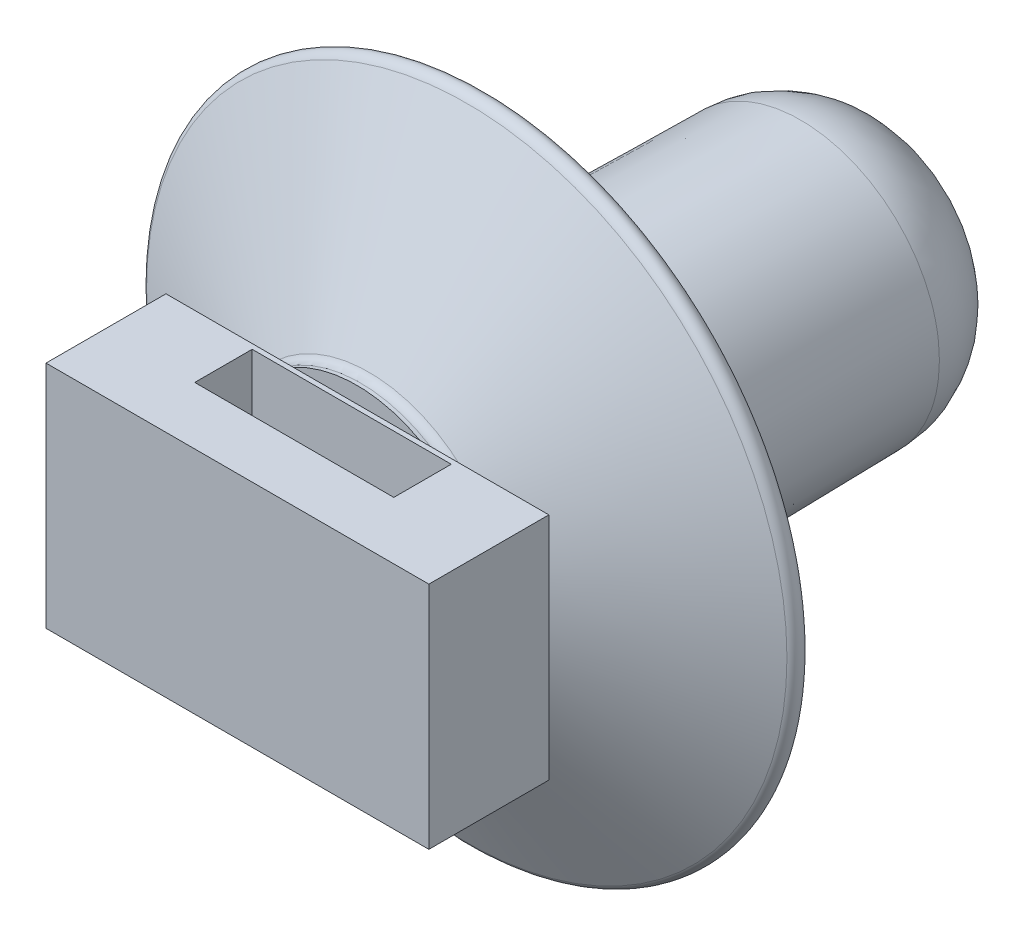
ISO-10303-21;
HEADER;
FILE_DESCRIPTION(('STEP AP214'),'2;1');
FILE_NAME('part.step','',(''),(''),'','','');
FILE_SCHEMA(('AUTOMOTIVE_DESIGN { 1 0 10303 214 1 1 1 1 }'));
ENDSEC;
DATA;
#1=APPLICATION_CONTEXT('core data for automotive mechanical design processes');
#2=APPLICATION_PROTOCOL_DEFINITION('international standard','automotive_design',2000,#1);
#3=PRODUCT_CONTEXT('',#1,'mechanical');
#4=PRODUCT('Part','Part','',(#3));
#5=PRODUCT_RELATED_PRODUCT_CATEGORY('part','',(#4));
#6=PRODUCT_DEFINITION_FORMATION('','',#4);
#7=PRODUCT_DEFINITION_CONTEXT('part definition',#1,'design');
#8=PRODUCT_DEFINITION('design','',#6,#7);
#9=PRODUCT_DEFINITION_SHAPE('','',#8);
#10=(LENGTH_UNIT() NAMED_UNIT(*) SI_UNIT(.MILLI.,.METRE.));
#11=(NAMED_UNIT(*) PLANE_ANGLE_UNIT() SI_UNIT($,.RADIAN.));
#12=(NAMED_UNIT(*) SI_UNIT($,.STERADIAN.) SOLID_ANGLE_UNIT());
#13=UNCERTAINTY_MEASURE_WITH_UNIT(LENGTH_MEASURE(1.E-05),#10,'distance_accuracy_value','');
#14=(GEOMETRIC_REPRESENTATION_CONTEXT(3) GLOBAL_UNCERTAINTY_ASSIGNED_CONTEXT((#13)) GLOBAL_UNIT_ASSIGNED_CONTEXT((#10,
#11,#12)) REPRESENTATION_CONTEXT('',''));
#15=CARTESIAN_POINT('',(0.,0.,0.));
#16=DIRECTION('',(0.,0.,1.));
#17=DIRECTION('',(1.,0.,0.));
#18=AXIS2_PLACEMENT_3D('',#15,#16,#17);
#19=CARTESIAN_POINT('',(0.019624843137266,0.,4.146));
#20=DIRECTION('',(0.,0.,1.));
#21=DIRECTION('',(1.,0.,0.));
#22=AXIS2_PLACEMENT_3D('',#19,#20,#21);
#23=PLANE('',#22);
#24=DIRECTION('',(-1.,0.,0.));
#25=VECTOR('',#24,1.);
#26=CARTESIAN_POINT('',(0.019624843137266,-2.99999999999994,4.146));
#27=LINE('',#26,#25);
#28=CARTESIAN_POINT('',(5.01962484313727,-2.99999999999994,4.146));
#29=VERTEX_POINT('',#28);
#30=CARTESIAN_POINT('',(-4.98037515686273,-2.99999999999994,4.146));
#31=VERTEX_POINT('',#30);
#32=EDGE_CURVE('E209',#29,#31,#27,.T.);
#33=ORIENTED_EDGE('',*,*,#32,.F.);
#34=DIRECTION('',(0.,-1.,0.));
#35=VECTOR('',#34,1.);
#36=CARTESIAN_POINT('',(5.01962484313727,0.,4.146));
#37=LINE('',#36,#35);
#38=CARTESIAN_POINT('',(5.01962484313727,3.00000000000007,4.146));
#39=VERTEX_POINT('',#38);
#40=EDGE_CURVE('E41',#39,#29,#37,.T.);
#41=ORIENTED_EDGE('',*,*,#40,.F.);
#42=DIRECTION('',(1.,0.,0.));
#43=VECTOR('',#42,1.);
#44=CARTESIAN_POINT('',(0.019624843137266,3.00000000000007,4.146));
#45=LINE('',#44,#43);
#46=CARTESIAN_POINT('',(-4.98037515686273,3.00000000000007,4.146));
#47=VERTEX_POINT('',#46);
#48=EDGE_CURVE('E221',#47,#39,#45,.T.);
#49=ORIENTED_EDGE('',*,*,#48,.F.);
#50=DIRECTION('',(0.,1.,0.));
#51=VECTOR('',#50,1.);
#52=CARTESIAN_POINT('',(-4.98037515686273,0.,4.146));
#53=LINE('',#52,#51);
#54=EDGE_CURVE('E244',#31,#47,#53,.T.);
#55=ORIENTED_EDGE('',*,*,#54,.F.);
#56=EDGE_LOOP('',(#33,#41,#49,#55));
#57=FACE_BOUND('',#56,.T.);
#58=ADVANCED_FACE('F16',(#57),#23,.T.);
#59=CARTESIAN_POINT('',(-1.08671064398304,0.,-13.0777778328722));
#60=CARTESIAN_POINT('',(-1.08671064398304,2.17345528796615,-13.0777778328722));
#61=CARTESIAN_POINT('',(1.08674464398311,2.17345528796615,-13.0777778328722));
#62=CARTESIAN_POINT('',(1.08674464398311,0.,-13.0777778328722));
#63=CARTESIAN_POINT('',(1.08674464398311,-2.17345528796615,-13.0777778328722));
#64=CARTESIAN_POINT('',(-1.08671064398304,-2.17345528796615,-13.0777778328722));
#65=CARTESIAN_POINT('',(-1.08671064398304,0.,-13.0777778328722));
#66=CARTESIAN_POINT('',(-2.55409895821178,0.,-13.0777778328722));
#67=CARTESIAN_POINT('',(-2.55409895821178,5.10823191642361,-13.0777778328722));
#68=CARTESIAN_POINT('',(2.55413295821183,5.10823191642361,-13.0777778328722));
#69=CARTESIAN_POINT('',(2.55413295821182,0.,-13.0777778328722));
#70=CARTESIAN_POINT('',(2.55413295821183,-5.10823191642361,-13.0777778328722));
#71=CARTESIAN_POINT('',(-2.55409895821178,-5.10823191642361,-13.0777778328722));
#72=CARTESIAN_POINT('',(-2.55409895821178,0.,-13.0777778328722));
#73=CARTESIAN_POINT('',(-3.60071433241901,0.,-12.0492717691039));
#74=CARTESIAN_POINT('',(-3.60071433241901,7.20146266483808,-12.0492717691039));
#75=CARTESIAN_POINT('',(3.60074833241908,7.20146266483808,-12.0492717691039));
#76=CARTESIAN_POINT('',(3.60074833241908,0.,-12.0492717691039));
#77=CARTESIAN_POINT('',(3.60074833241908,-7.20146266483808,-12.0492717691039));
#78=CARTESIAN_POINT('',(-3.60071433241901,-7.20146266483808,-12.0492717691039));
#79=CARTESIAN_POINT('',(-3.60071433241901,0.,-12.0492717691039));
#80=CARTESIAN_POINT('',(-3.62632378968028,0.,-10.5821069452229));
#81=CARTESIAN_POINT('',(-3.62632378968028,7.25268157936061,-10.5821069452229));
#82=CARTESIAN_POINT('',(3.62635778968033,7.25268157936061,-10.5821069452229));
#83=CARTESIAN_POINT('',(3.62635778968033,0.,-10.5821069452229));
#84=CARTESIAN_POINT('',(3.62635778968033,-7.25268157936061,-10.5821069452229));
#85=CARTESIAN_POINT('',(-3.62632378968028,-7.25268157936061,-10.5821069452229));
#86=CARTESIAN_POINT('',(-3.62632378968028,0.,-10.5821069452229));
#87=(BOUNDED_SURFACE() B_SPLINE_SURFACE(3,3,((#59,#60,#61,#62,#63,#64,#65),(#66,#67,#68,#69,#70,
#71,#72),(#73,#74,#75,#76,#77,#78,#79),(#80,#81,#82,#83,#84,#85,#86)),.UNSPECIFIED.,.F.,.T.,
.F.) B_SPLINE_SURFACE_WITH_KNOTS((4,4),(4,3,4),(0.,1.),(0.,0.5,1.),
.UNSPECIFIED.) GEOMETRIC_REPRESENTATION_ITEM() RATIONAL_B_SPLINE_SURFACE(((1.,0.333333333333333,
0.333333333333333,1.,0.333333333333333,0.333333333333333,1.),(0.808833632769457,
0.269611210923152,0.269611210923152,0.808833632769457,0.269611210923152,0.269611210923152,
0.808833632769457),(0.808833632769457,0.269611210923152,0.269611210923152,0.808833632769457,
0.269611210923152,0.269611210923152,0.808833632769457),(1.,0.333333333333333,0.333333333333333,
1.,0.333333333333333,0.333333333333333,1.))) REPRESENTATION_ITEM('') SURFACE());
#88=CARTESIAN_POINT('',(1.70000000335527E-05,0.,-13.0777778328722));
#89=DIRECTION('',(0.,0.,-1.));
#90=DIRECTION('',(-1.,0.,0.));
#91=AXIS2_PLACEMENT_3D('',#88,#89,#90);
#92=CIRCLE('',#91,1.08672764398307);
#93=CARTESIAN_POINT('',(-1.08671064398304,0.,-13.0777778328722));
#94=VERTEX_POINT('',#93);
#95=EDGE_CURVE('E165',#94,#94,#92,.T.);
#96=CARTESIAN_POINT('',(1.70000000335527E-05,0.,-10.5821069452229));
#97=DIRECTION('',(0.,0.,1.));
#98=DIRECTION('',(-1.,0.,0.));
#99=AXIS2_PLACEMENT_3D('',#96,#97,#98);
#100=CIRCLE('',#99,3.62634078968032);
#101=CARTESIAN_POINT('',(-3.62632378968028,0.,-10.5821069452229));
#102=VERTEX_POINT('',#101);
#103=EDGE_CURVE('E167',#102,#102,#100,.T.);
#104=ORIENTED_EDGE('',*,*,#95,.F.);
#105=EDGE_LOOP('',(#104));
#106=FACE_BOUND('',#105,.T.);
#107=ORIENTED_EDGE('',*,*,#103,.F.);
#108=EDGE_LOOP('',(#107));
#109=FACE_BOUND('',#108,.T.);
#110=ADVANCED_FACE('F294',(#106,#109),#87,.T.);
#111=CARTESIAN_POINT('',(2.600017,-6.175,2.642));
#112=DIRECTION('',(0.,0.,1.));
#113=DIRECTION('',(1.,0.,0.));
#114=AXIS2_PLACEMENT_3D('',#111,#112,#113);
#115=PLANE('',#114);
#116=DIRECTION('',(-1.,0.,0.));
#117=VECTOR('',#116,1.);
#118=CARTESIAN_POINT('',(0.019624843137266,-2.99999999999994,2.642));
#119=LINE('',#118,#117);
#120=CARTESIAN_POINT('',(2.600017,-2.99999999999994,2.642));
#121=VERTEX_POINT('',#120);
#122=CARTESIAN_POINT('',(-2.599983,-2.99999999999994,2.642));
#123=VERTEX_POINT('',#122);
#124=EDGE_CURVE('E140',#121,#123,#119,.T.);
#125=ORIENTED_EDGE('',*,*,#124,.T.);
#126=DIRECTION('',(0.,1.,0.));
#127=VECTOR('',#126,1.);
#128=CARTESIAN_POINT('',(-2.599983,3.35000000000006,2.642));
#129=LINE('',#128,#127);
#130=CARTESIAN_POINT('',(-2.599983,3.00000000000007,2.642));
#131=VERTEX_POINT('',#130);
#132=EDGE_CURVE('E125',#123,#131,#129,.T.);
#133=ORIENTED_EDGE('',*,*,#132,.T.);
#134=DIRECTION('',(1.,0.,0.));
#135=VECTOR('',#134,1.);
#136=CARTESIAN_POINT('',(0.019624843137266,3.00000000000007,2.642));
#137=LINE('',#136,#135);
#138=CARTESIAN_POINT('',(2.600017,3.00000000000007,2.642));
#139=VERTEX_POINT('',#138);
#140=EDGE_CURVE('E202',#131,#139,#137,.T.);
#141=ORIENTED_EDGE('',*,*,#140,.T.);
#142=DIRECTION('',(0.,1.,0.));
#143=VECTOR('',#142,1.);
#144=CARTESIAN_POINT('',(2.600017,3.35000000000006,2.642));
#145=LINE('',#144,#143);
#146=EDGE_CURVE('E10',#121,#139,#145,.T.);
#147=ORIENTED_EDGE('',*,*,#146,.F.);
#148=EDGE_LOOP('',(#125,#133,#141,#147));
#149=FACE_BOUND('',#148,.T.);
#150=ADVANCED_FACE('F141',(#149),#115,.F.);
#151=CARTESIAN_POINT('',(2.600017,-6.175,1.142));
#152=DIRECTION('',(1.,0.,0.));
#153=DIRECTION('',(0.,1.,0.));
#154=AXIS2_PLACEMENT_3D('',#151,#152,#153);
#155=PLANE('',#154);
#156=DIRECTION('',(0.,0.,1.));
#157=VECTOR('',#156,1.);
#158=CARTESIAN_POINT('',(2.600017,-2.99999999999994,1.012));
#159=LINE('',#158,#157);
#160=CARTESIAN_POINT('',(2.600017,-2.99999999999994,1.142));
#161=VERTEX_POINT('',#160);
#162=EDGE_CURVE('E146',#161,#121,#159,.T.);
#163=ORIENTED_EDGE('',*,*,#162,.T.);
#164=ORIENTED_EDGE('',*,*,#146,.T.);
#165=DIRECTION('',(0.,0.,-1.));
#166=VECTOR('',#165,1.);
#167=CARTESIAN_POINT('',(2.600017,3.00000000000007,1.012));
#168=LINE('',#167,#166);
#169=CARTESIAN_POINT('',(2.600017,3.00000000000007,1.142));
#170=VERTEX_POINT('',#169);
#171=EDGE_CURVE('E200',#139,#170,#168,.T.);
#172=ORIENTED_EDGE('',*,*,#171,.T.);
#173=DIRECTION('',(0.,1.,0.));
#174=VECTOR('',#173,1.);
#175=CARTESIAN_POINT('',(2.600017,3.35000000000006,1.142));
#176=LINE('',#175,#174);
#177=EDGE_CURVE('E27',#161,#170,#176,.T.);
#178=ORIENTED_EDGE('',*,*,#177,.F.);
#179=EDGE_LOOP('',(#163,#164,#172,#178));
#180=FACE_BOUND('',#179,.T.);
#181=ADVANCED_FACE('F322',(#180),#155,.F.);
#182=CARTESIAN_POINT('',(-2.599983,-6.175,1.142));
#183=DIRECTION('',(0.,0.,-1.));
#184=DIRECTION('',(0.,-1.,0.));
#185=AXIS2_PLACEMENT_3D('',#182,#183,#184);
#186=PLANE('',#185);
#187=DIRECTION('',(1.,0.,0.));
#188=VECTOR('',#187,1.);
#189=CARTESIAN_POINT('',(0.019624843137266,-2.99999999999994,1.142));
#190=LINE('',#189,#188);
#191=CARTESIAN_POINT('',(-2.599983,-2.99999999999994,1.142));
#192=VERTEX_POINT('',#191);
#193=EDGE_CURVE('E151',#192,#161,#190,.T.);
#194=ORIENTED_EDGE('',*,*,#193,.T.);
#195=ORIENTED_EDGE('',*,*,#177,.T.);
#196=DIRECTION('',(-1.,0.,0.));
#197=VECTOR('',#196,1.);
#198=CARTESIAN_POINT('',(0.019624843137266,3.00000000000007,1.142));
#199=LINE('',#198,#197);
#200=CARTESIAN_POINT('',(-2.599983,3.00000000000007,1.142));
#201=VERTEX_POINT('',#200);
#202=EDGE_CURVE('E203',#170,#201,#199,.T.);
#203=ORIENTED_EDGE('',*,*,#202,.T.);
#204=DIRECTION('',(0.,1.,0.));
#205=VECTOR('',#204,1.);
#206=CARTESIAN_POINT('',(-2.599983,3.35000000000006,1.142));
#207=LINE('',#206,#205);
#208=EDGE_CURVE('E137',#192,#201,#207,.T.);
#209=ORIENTED_EDGE('',*,*,#208,.F.);
#210=EDGE_LOOP('',(#194,#195,#203,#209));
#211=FACE_BOUND('',#210,.T.);
#212=ADVANCED_FACE('F317',(#211),#186,.F.);
#213=CARTESIAN_POINT('',(-2.599983,-6.175,2.642));
#214=DIRECTION('',(-1.,0.,0.));
#215=DIRECTION('',(0.,0.,1.));
#216=AXIS2_PLACEMENT_3D('',#213,#214,#215);
#217=PLANE('',#216);
#218=DIRECTION('',(0.,0.,-1.));
#219=VECTOR('',#218,1.);
#220=CARTESIAN_POINT('',(-2.599983,-2.99999999999994,1.012));
#221=LINE('',#220,#219);
#222=EDGE_CURVE('E130',#123,#192,#221,.T.);
#223=ORIENTED_EDGE('',*,*,#222,.T.);
#224=ORIENTED_EDGE('',*,*,#208,.T.);
#225=DIRECTION('',(0.,0.,1.));
#226=VECTOR('',#225,1.);
#227=CARTESIAN_POINT('',(-2.599983,3.00000000000007,1.012));
#228=LINE('',#227,#226);
#229=EDGE_CURVE('E132',#201,#131,#228,.T.);
#230=ORIENTED_EDGE('',*,*,#229,.T.);
#231=ORIENTED_EDGE('',*,*,#132,.F.);
#232=EDGE_LOOP('',(#223,#224,#230,#231));
#233=FACE_BOUND('',#232,.T.);
#234=ADVANCED_FACE('F127',(#233),#217,.F.);
#235=CARTESIAN_POINT('',(5.01962484313727,0.,1.012));
#236=DIRECTION('',(1.,0.,0.));
#237=DIRECTION('',(0.,1.,0.));
#238=AXIS2_PLACEMENT_3D('',#235,#236,#237);
#239=PLANE('',#238);
#240=DIRECTION('',(0.,1.,0.));
#241=VECTOR('',#240,1.);
#242=CARTESIAN_POINT('',(5.01962484313727,0.,1.012));
#243=LINE('',#242,#241);
#244=CARTESIAN_POINT('',(5.01962484313727,-2.99999999999994,1.012));
#245=VERTEX_POINT('',#244);
#246=CARTESIAN_POINT('',(5.01962484313727,3.00000000000007,1.012));
#247=VERTEX_POINT('',#246);
#248=EDGE_CURVE('E228',#245,#247,#243,.T.);
#249=ORIENTED_EDGE('',*,*,#248,.T.);
#250=DIRECTION('',(0.,0.,1.));
#251=VECTOR('',#250,1.);
#252=CARTESIAN_POINT('',(5.01962484313727,3.00000000000007,1.012));
#253=LINE('',#252,#251);
#254=EDGE_CURVE('E225',#247,#39,#253,.T.);
#255=ORIENTED_EDGE('',*,*,#254,.T.);
#256=ORIENTED_EDGE('',*,*,#40,.T.);
#257=DIRECTION('',(0.,0.,1.));
#258=VECTOR('',#257,1.);
#259=CARTESIAN_POINT('',(5.01962484313727,-2.99999999999994,1.012));
#260=LINE('',#259,#258);
#261=EDGE_CURVE('E205',#245,#29,#260,.T.);
#262=ORIENTED_EDGE('',*,*,#261,.F.);
#263=EDGE_LOOP('',(#249,#255,#256,#262));
#264=FACE_BOUND('',#263,.T.);
#265=ADVANCED_FACE('F305',(#264),#239,.T.);
#266=CARTESIAN_POINT('',(0.019624843137266,3.00000000000007,1.012));
#267=DIRECTION('',(0.,1.,0.));
#268=DIRECTION('',(1.,0.,0.));
#269=AXIS2_PLACEMENT_3D('',#266,#267,#268);
#270=PLANE('',#269);
#271=DIRECTION('',(0.,0.,1.));
#272=VECTOR('',#271,1.);
#273=CARTESIAN_POINT('',(-4.98037515686273,3.00000000000007,1.012));
#274=LINE('',#273,#272);
#275=CARTESIAN_POINT('',(-4.98037515686273,3.00000000000007,1.012));
#276=VERTEX_POINT('',#275);
#277=EDGE_CURVE('E260',#276,#47,#274,.T.);
#278=ORIENTED_EDGE('',*,*,#277,.T.);
#279=ORIENTED_EDGE('',*,*,#48,.T.);
#280=ORIENTED_EDGE('',*,*,#254,.F.);
#281=DIRECTION('',(-1.,0.,0.));
#282=VECTOR('',#281,1.);
#283=CARTESIAN_POINT('',(0.019624843137266,3.00000000000007,1.012));
#284=LINE('',#283,#282);
#285=CARTESIAN_POINT('',(1.65247728696602,3.00000000000007,1.012));
#286=VERTEX_POINT('',#285);
#287=EDGE_CURVE('E232',#247,#286,#284,.T.);
#288=ORIENTED_EDGE('',*,*,#287,.T.);
#289=DIRECTION('',(-1.,0.,0.));
#290=VECTOR('',#289,1.);
#291=CARTESIAN_POINT('',(0.019624843137266,3.00000000000007,1.012));
#292=LINE('',#291,#290);
#293=CARTESIAN_POINT('',(-1.65244328696596,3.00000000000007,1.012));
#294=VERTEX_POINT('',#293);
#295=EDGE_CURVE('E187',#286,#294,#292,.T.);
#296=ORIENTED_EDGE('',*,*,#295,.T.);
#297=DIRECTION('',(-1.,0.,0.));
#298=VECTOR('',#297,1.);
#299=CARTESIAN_POINT('',(0.019624843137266,3.00000000000007,1.012));
#300=LINE('',#299,#298);
#301=EDGE_CURVE('E153',#294,#276,#300,.T.);
#302=ORIENTED_EDGE('',*,*,#301,.T.);
#303=EDGE_LOOP('',(#278,#279,#280,#288,#296,#302));
#304=FACE_BOUND('',#303,.T.);
#305=ORIENTED_EDGE('',*,*,#229,.F.);
#306=ORIENTED_EDGE('',*,*,#202,.F.);
#307=ORIENTED_EDGE('',*,*,#171,.F.);
#308=ORIENTED_EDGE('',*,*,#140,.F.);
#309=EDGE_LOOP('',(#305,#306,#307,#308));
#310=FACE_BOUND('',#309,.T.);
#311=ADVANCED_FACE('F268',(#304,#310),#270,.T.);
#312=CARTESIAN_POINT('',(-4.98037515686273,0.,1.012));
#313=DIRECTION('',(-1.,0.,0.));
#314=DIRECTION('',(0.,0.,1.));
#315=AXIS2_PLACEMENT_3D('',#312,#313,#314);
#316=PLANE('',#315);
#317=DIRECTION('',(0.,0.,1.));
#318=VECTOR('',#317,1.);
#319=CARTESIAN_POINT('',(-4.98037515686273,-2.99999999999994,1.012));
#320=LINE('',#319,#318);
#321=CARTESIAN_POINT('',(-4.98037515686273,-2.99999999999994,1.012));
#322=VERTEX_POINT('',#321);
#323=EDGE_CURVE('E237',#322,#31,#320,.T.);
#324=ORIENTED_EDGE('',*,*,#323,.T.);
#325=ORIENTED_EDGE('',*,*,#54,.T.);
#326=ORIENTED_EDGE('',*,*,#277,.F.);
#327=DIRECTION('',(0.,-1.,0.));
#328=VECTOR('',#327,1.);
#329=CARTESIAN_POINT('',(-4.98037515686273,0.,1.012));
#330=LINE('',#329,#328);
#331=EDGE_CURVE('E20',#276,#322,#330,.T.);
#332=ORIENTED_EDGE('',*,*,#331,.T.);
#333=EDGE_LOOP('',(#324,#325,#326,#332));
#334=FACE_BOUND('',#333,.T.);
#335=ADVANCED_FACE('F304',(#334),#316,.T.);
#336=CARTESIAN_POINT('',(0.019624843137266,-2.99999999999994,1.012));
#337=DIRECTION('',(0.,-1.,0.));
#338=DIRECTION('',(0.,0.,-1.));
#339=AXIS2_PLACEMENT_3D('',#336,#337,#338);
#340=PLANE('',#339);
#341=ORIENTED_EDGE('',*,*,#261,.T.);
#342=ORIENTED_EDGE('',*,*,#32,.T.);
#343=ORIENTED_EDGE('',*,*,#323,.F.);
#344=DIRECTION('',(1.,0.,0.));
#345=VECTOR('',#344,1.);
#346=CARTESIAN_POINT('',(0.019624843137266,-2.99999999999994,1.012));
#347=LINE('',#346,#345);
#348=CARTESIAN_POINT('',(-1.65244328696618,-2.99999999999994,1.012));
#349=VERTEX_POINT('',#348);
#350=EDGE_CURVE('E163',#322,#349,#347,.T.);
#351=ORIENTED_EDGE('',*,*,#350,.T.);
#352=DIRECTION('',(1.,0.,0.));
#353=VECTOR('',#352,1.);
#354=CARTESIAN_POINT('',(0.019624843137266,-2.99999999999994,1.012));
#355=LINE('',#354,#353);
#356=CARTESIAN_POINT('',(1.65247728696626,-2.99999999999994,1.012));
#357=VERTEX_POINT('',#356);
#358=EDGE_CURVE('E215',#349,#357,#355,.T.);
#359=ORIENTED_EDGE('',*,*,#358,.T.);
#360=DIRECTION('',(1.,0.,0.));
#361=VECTOR('',#360,1.);
#362=CARTESIAN_POINT('',(0.019624843137266,-2.99999999999994,1.012));
#363=LINE('',#362,#361);
#364=EDGE_CURVE('E231',#357,#245,#363,.T.);
#365=ORIENTED_EDGE('',*,*,#364,.T.);
#366=EDGE_LOOP('',(#341,#342,#343,#351,#359,#365));
#367=FACE_BOUND('',#366,.T.);
#368=ORIENTED_EDGE('',*,*,#222,.F.);
#369=ORIENTED_EDGE('',*,*,#124,.F.);
#370=ORIENTED_EDGE('',*,*,#162,.F.);
#371=ORIENTED_EDGE('',*,*,#193,.F.);
#372=EDGE_LOOP('',(#368,#369,#370,#371));
#373=FACE_BOUND('',#372,.T.);
#374=ADVANCED_FACE('F149',(#367,#373),#340,.T.);
#375=CARTESIAN_POINT('',(0.019624843137266,0.,1.012));
#376=DIRECTION('',(0.,0.,-1.));
#377=DIRECTION('',(0.,-1.,0.));
#378=AXIS2_PLACEMENT_3D('',#375,#376,#377);
#379=PLANE('',#378);
#380=CARTESIAN_POINT('',(1.70000000335957E-05,0.,1.012));
#381=DIRECTION('',(0.,0.,-1.));
#382=DIRECTION('',(-1.,0.,0.));
#383=AXIS2_PLACEMENT_3D('',#380,#381,#382);
#384=CIRCLE('',#383,3.425);
#385=EDGE_CURVE('E176',#349,#294,#384,.T.);
#386=ORIENTED_EDGE('',*,*,#385,.F.);
#387=ORIENTED_EDGE('',*,*,#350,.F.);
#388=ORIENTED_EDGE('',*,*,#331,.F.);
#389=ORIENTED_EDGE('',*,*,#301,.F.);
#390=EDGE_LOOP('',(#386,#387,#388,#389));
#391=FACE_BOUND('',#390,.T.);
#392=ADVANCED_FACE('F329',(#391),#379,.T.);
#393=CARTESIAN_POINT('',(0.019624843137266,0.,1.012));
#394=DIRECTION('',(0.,0.,-1.));
#395=DIRECTION('',(0.,-1.,0.));
#396=AXIS2_PLACEMENT_3D('',#393,#394,#395);
#397=PLANE('',#396);
#398=CARTESIAN_POINT('',(1.70000000335957E-05,0.,1.012));
#399=DIRECTION('',(0.,0.,-1.));
#400=DIRECTION('',(-1.,0.,0.));
#401=AXIS2_PLACEMENT_3D('',#398,#399,#400);
#402=CIRCLE('',#401,3.425);
#403=EDGE_CURVE('E173',#286,#357,#402,.T.);
#404=ORIENTED_EDGE('',*,*,#403,.F.);
#405=ORIENTED_EDGE('',*,*,#287,.F.);
#406=ORIENTED_EDGE('',*,*,#248,.F.);
#407=ORIENTED_EDGE('',*,*,#364,.F.);
#408=EDGE_LOOP('',(#404,#405,#406,#407));
#409=FACE_BOUND('',#408,.T.);
#410=ADVANCED_FACE('F289',(#409),#397,.T.);
#411=CARTESIAN_POINT('',(1.70000000335957E-05,0.,0.91221515475689));
#412=DIRECTION('',(0.,0.,-1.));
#413=DIRECTION('',(-1.,0.,0.));
#414=AXIS2_PLACEMENT_3D('',#411,#412,#413);
#415=TOROIDAL_SURFACE('',#414,3.675,0.25);
#416=CARTESIAN_POINT('',(1.70000000335957E-05,0.,0.691478256542159));
#417=DIRECTION('',(0.,0.,-1.));
#418=DIRECTION('',(1.,0.,0.));
#419=AXIS2_PLACEMENT_3D('',#416,#417,#418);
#420=CIRCLE('',#419,3.55763210930354);
#421=CARTESIAN_POINT('',(3.55764910930358,0.,0.691478256542159));
#422=VERTEX_POINT('',#421);
#423=EDGE_CURVE('E168',#422,#422,#420,.T.);
#424=ORIENTED_EDGE('',*,*,#423,.F.);
#425=EDGE_LOOP('',(#424));
#426=FACE_BOUND('',#425,.T.);
#427=CARTESIAN_POINT('',(1.70000000335957E-05,0.,0.91221515475689));
#428=DIRECTION('',(0.,0.,1.));
#429=DIRECTION('',(-1.,0.,0.));
#430=AXIS2_PLACEMENT_3D('',#427,#428,#429);
#431=CIRCLE('',#430,3.425);
#432=CARTESIAN_POINT('',(-3.424983,0.,0.91221515475689));
#433=VERTEX_POINT('',#432);
#434=EDGE_CURVE('E190',#433,#433,#431,.T.);
#435=ORIENTED_EDGE('',*,*,#434,.F.);
#436=EDGE_LOOP('',(#435));
#437=FACE_BOUND('',#436,.T.);
#438=ADVANCED_FACE('F282',(#426,#437),#415,.F.);
#439=CARTESIAN_POINT('',(3.42501700000005,0.,1.012));
#440=DIRECTION('',(0.,0.,1.));
#441=DIRECTION('',(1.,0.,0.));
#442=AXIS2_PLACEMENT_3D('',#439,#440,#441);
#443=PLANE('',#442);
#444=ORIENTED_EDGE('',*,*,#295,.F.);
#445=CARTESIAN_POINT('',(1.70000000335957E-05,0.,1.012));
#446=DIRECTION('',(0.,0.,-1.));
#447=DIRECTION('',(-1.,0.,0.));
#448=AXIS2_PLACEMENT_3D('',#445,#446,#447);
#449=CIRCLE('',#448,3.425);
#450=EDGE_CURVE('E177',#294,#286,#449,.T.);
#451=ORIENTED_EDGE('',*,*,#450,.F.);
#452=EDGE_LOOP('',(#444,#451));
#453=FACE_BOUND('',#452,.T.);
#454=ADVANCED_FACE('F280',(#453),#443,.T.);
#455=CARTESIAN_POINT('',(1.70000000335957E-05,0.,1.012));
#456=DIRECTION('',(0.,0.,-1.));
#457=DIRECTION('',(-1.,0.,0.));
#458=AXIS2_PLACEMENT_3D('',#455,#456,#457);
#459=CYLINDRICAL_SURFACE('',#458,3.425);
#460=ORIENTED_EDGE('',*,*,#450,.T.);
#461=ORIENTED_EDGE('',*,*,#403,.T.);
#462=CARTESIAN_POINT('',(1.70000000335957E-05,0.,1.012));
#463=DIRECTION('',(0.,0.,-1.));
#464=DIRECTION('',(-1.,0.,0.));
#465=AXIS2_PLACEMENT_3D('',#462,#463,#464);
#466=CIRCLE('',#465,3.425);
#467=EDGE_CURVE('E172',#357,#349,#466,.T.);
#468=ORIENTED_EDGE('',*,*,#467,.T.);
#469=ORIENTED_EDGE('',*,*,#385,.T.);
#470=EDGE_LOOP('',(#460,#461,#468,#469));
#471=FACE_BOUND('',#470,.T.);
#472=ORIENTED_EDGE('',*,*,#434,.T.);
#473=EDGE_LOOP('',(#472));
#474=FACE_BOUND('',#473,.T.);
#475=ADVANCED_FACE('F18',(#471,#474),#459,.T.);
#476=CARTESIAN_POINT('',(1.70000000335527E-05,0.,-0.0602778328722087));
#477=DIRECTION('',(0.,0.,1.));
#478=DIRECTION('',(1.,0.,0.));
#479=AXIS2_PLACEMENT_3D('',#476,#477,#478);
#480=CONICAL_SURFACE('',#479,3.81,0.0174532924999985);
#481=CARTESIAN_POINT('',(1.70000000335957E-05,0.,-0.244022264754717));
#482=DIRECTION('',(0.,0.,-1.));
#483=DIRECTION('',(1.,0.,0.));
#484=AXIS2_PLACEMENT_3D('',#481,#482,#483);
#485=CIRCLE('',#484,3.80679272901131);
#486=CARTESIAN_POINT('',(3.80680972901132,0.,-0.244022264754717));
#487=VERTEX_POINT('',#486);
#488=EDGE_CURVE('E240',#487,#487,#485,.T.);
#489=ORIENTED_EDGE('',*,*,#488,.T.);
#490=EDGE_LOOP('',(#489));
#491=FACE_BOUND('',#490,.T.);
#492=ORIENTED_EDGE('',*,*,#103,.T.);
#493=EDGE_LOOP('',(#492));
#494=FACE_BOUND('',#493,.T.);
#495=ADVANCED_FACE('F288',(#491,#494),#480,.T.);
#496=CARTESIAN_POINT('',(1.70000000335527E-05,0.,-13.0777778328722));
#497=DIRECTION('',(0.,0.,-1.));
#498=DIRECTION('',(0.,-1.,0.));
#499=AXIS2_PLACEMENT_3D('',#496,#497,#498);
#500=PLANE('',#499);
#501=ORIENTED_EDGE('',*,*,#95,.T.);
#502=EDGE_LOOP('',(#501));
#503=FACE_BOUND('',#502,.T.);
#504=ADVANCED_FACE('F320',(#503),#500,.T.);
#505=CARTESIAN_POINT('',(1.70000000335957E-05,0.,0.762));
#506=DIRECTION('',(0.,0.,-1.));
#507=DIRECTION('',(-1.,0.,0.));
#508=AXIS2_PLACEMENT_3D('',#505,#506,#507);
#509=CONICAL_SURFACE('',#508,3.425,1.082104135);
#510=CARTESIAN_POINT('',(1.70000000335957E-05,0.,-1.86354758128542));
#511=DIRECTION('',(0.,0.,-1.));
#512=DIRECTION('',(-1.,0.,0.));
#513=AXIS2_PLACEMENT_3D('',#510,#511,#512);
#514=CIRCLE('',#513,8.36293682214955);
#515=CARTESIAN_POINT('',(-8.36291982214951,0.,-1.86354758128542));
#516=VERTEX_POINT('',#515);
#517=EDGE_CURVE('E171',#516,#516,#514,.T.);
#518=ORIENTED_EDGE('',*,*,#517,.F.);
#519=EDGE_LOOP('',(#518));
#520=FACE_BOUND('',#519,.T.);
#521=ORIENTED_EDGE('',*,*,#423,.T.);
#522=EDGE_LOOP('',(#521));
#523=FACE_BOUND('',#522,.T.);
#524=ADVANCED_FACE('F338',(#520,#523),#509,.T.);
#525=CARTESIAN_POINT('',(1.70000000335957E-05,0.,-0.060277832872209));
#526=DIRECTION('',(0.,0.,-1.));
#527=DIRECTION('',(-1.,0.,0.));
#528=AXIS2_PLACEMENT_3D('',#525,#526,#527);
#529=CONICAL_SURFACE('',#528,3.425,1.12224670775);
#530=CARTESIAN_POINT('',(1.70000000335957E-05,0.,-2.32445422800009));
#531=DIRECTION('',(0.,0.,-1.));
#532=DIRECTION('',(-1.,0.,0.));
#533=AXIS2_PLACEMENT_3D('',#530,#531,#532);
#534=CIRCLE('',#533,8.1296110513517);
#535=CARTESIAN_POINT('',(-8.12959405135167,0.,-2.32445422800009));
#536=VERTEX_POINT('',#535);
#537=EDGE_CURVE('E169',#536,#536,#534,.T.);
#538=ORIENTED_EDGE('',*,*,#537,.T.);
#539=EDGE_LOOP('',(#538));
#540=FACE_BOUND('',#539,.T.);
#541=ORIENTED_EDGE('',*,*,#488,.F.);
#542=EDGE_LOOP('',(#541));
#543=FACE_BOUND('',#542,.T.);
#544=ADVANCED_FACE('F340',(#540,#543),#529,.F.);
#545=CARTESIAN_POINT('',(1.70000000344201E-05,0.,-2.09165901596774));
#546=DIRECTION('',(0.,0.,-1.));
#547=DIRECTION('',(-1.,0.,0.));
#548=AXIS2_PLACEMENT_3D('',#545,#546,#547);
#549=TOROIDAL_SURFACE('',#548,8.24164782085915,0.258352179140895);
#550=ORIENTED_EDGE('',*,*,#517,.T.);
#551=EDGE_LOOP('',(#550));
#552=FACE_BOUND('',#551,.T.);
#553=ORIENTED_EDGE('',*,*,#537,.F.);
#554=EDGE_LOOP('',(#553));
#555=FACE_BOUND('',#554,.T.);
#556=ADVANCED_FACE('F343',(#552,#555),#549,.T.);
#557=CARTESIAN_POINT('',(3.42501700000005,0.,1.012));
#558=DIRECTION('',(0.,0.,1.));
#559=DIRECTION('',(1.,0.,0.));
#560=AXIS2_PLACEMENT_3D('',#557,#558,#559);
#561=PLANE('',#560);
#562=ORIENTED_EDGE('',*,*,#358,.F.);
#563=ORIENTED_EDGE('',*,*,#467,.F.);
#564=EDGE_LOOP('',(#562,#563));
#565=FACE_BOUND('',#564,.T.);
#566=ADVANCED_FACE('F346',(#565),#561,.T.);
#567=CLOSED_SHELL('',(#58,#110,#150,#181,#212,#234,#265,#311,#335,#374,#392,#410,#438,#454,#475,
#495,#504,#524,#544,#556,#566));
#568=MANIFOLD_SOLID_BREP('B1',#567);
#569=ADVANCED_BREP_SHAPE_REPRESENTATION('',(#18,#568),#14);
#570=SHAPE_DEFINITION_REPRESENTATION(#9,#569);
ENDSEC;
END-ISO-10303-21;
